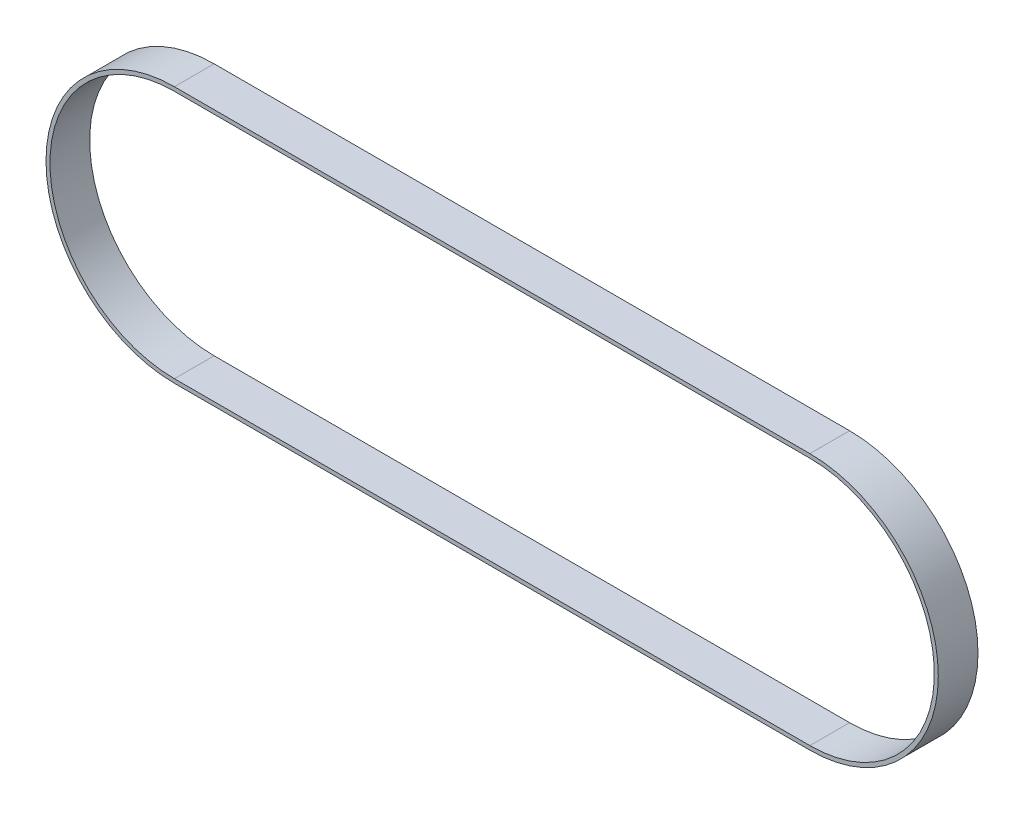
ISO-10303-21;
HEADER;
FILE_DESCRIPTION(('STEP AP214'),'2;1');
FILE_NAME('part.step','',(''),(''),'','','');
FILE_SCHEMA(('AUTOMOTIVE_DESIGN { 1 0 10303 214 1 1 1 1 }'));
ENDSEC;
DATA;
#1=APPLICATION_CONTEXT('core data for automotive mechanical design processes');
#2=APPLICATION_PROTOCOL_DEFINITION('international standard','automotive_design',2000,#1);
#3=PRODUCT_CONTEXT('',#1,'mechanical');
#4=PRODUCT('Part','Part','',(#3));
#5=PRODUCT_RELATED_PRODUCT_CATEGORY('part','',(#4));
#6=PRODUCT_DEFINITION_FORMATION('','',#4);
#7=PRODUCT_DEFINITION_CONTEXT('part definition',#1,'design');
#8=PRODUCT_DEFINITION('design','',#6,#7);
#9=PRODUCT_DEFINITION_SHAPE('','',#8);
#10=(LENGTH_UNIT() NAMED_UNIT(*) SI_UNIT(.MILLI.,.METRE.));
#11=(NAMED_UNIT(*) PLANE_ANGLE_UNIT() SI_UNIT($,.RADIAN.));
#12=(NAMED_UNIT(*) SI_UNIT($,.STERADIAN.) SOLID_ANGLE_UNIT());
#13=UNCERTAINTY_MEASURE_WITH_UNIT(LENGTH_MEASURE(1.E-05),#10,'distance_accuracy_value','');
#14=(GEOMETRIC_REPRESENTATION_CONTEXT(3) GLOBAL_UNCERTAINTY_ASSIGNED_CONTEXT((#13)) GLOBAL_UNIT_ASSIGNED_CONTEXT((#10,
#11,#12)) REPRESENTATION_CONTEXT('',''));
#15=CARTESIAN_POINT('',(0.,0.,0.));
#16=DIRECTION('',(0.,0.,1.));
#17=DIRECTION('',(1.,0.,0.));
#18=AXIS2_PLACEMENT_3D('',#15,#16,#17);
#19=CARTESIAN_POINT('',(0.,0.,3.));
#20=DIRECTION('',(0.,0.,1.));
#21=DIRECTION('',(1.,0.,0.));
#22=AXIS2_PLACEMENT_3D('',#19,#20,#21);
#23=PLANE('',#22);
#24=CARTESIAN_POINT('',(0.,0.,3.));
#25=DIRECTION('',(0.,0.,1.));
#26=DIRECTION('',(1.,0.,0.));
#27=AXIS2_PLACEMENT_3D('',#24,#25,#26);
#28=CIRCLE('',#27,19.4);
#29=CARTESIAN_POINT('',(0.,19.4,3.));
#30=VERTEX_POINT('',#29);
#31=CARTESIAN_POINT('',(0.,-19.4,3.));
#32=VERTEX_POINT('',#31);
#33=EDGE_CURVE('E142',#30,#32,#28,.T.);
#34=ORIENTED_EDGE('',*,*,#33,.T.);
#35=DIRECTION('',(1.,0.,0.));
#36=VECTOR('',#35,1.);
#37=CARTESIAN_POINT('',(0.,-19.4,3.));
#38=LINE('',#37,#36);
#39=CARTESIAN_POINT('',(96.,-19.4,3.));
#40=VERTEX_POINT('',#39);
#41=EDGE_CURVE('E145',#32,#40,#38,.T.);
#42=ORIENTED_EDGE('',*,*,#41,.T.);
#43=CARTESIAN_POINT('',(96.,0.,3.));
#44=DIRECTION('',(0.,0.,1.));
#45=DIRECTION('',(1.,0.,0.));
#46=AXIS2_PLACEMENT_3D('',#43,#44,#45);
#47=CIRCLE('',#46,19.4);
#48=CARTESIAN_POINT('',(96.,19.4,3.));
#49=VERTEX_POINT('',#48);
#50=EDGE_CURVE('E148',#40,#49,#47,.T.);
#51=ORIENTED_EDGE('',*,*,#50,.T.);
#52=DIRECTION('',(-1.,0.,0.));
#53=VECTOR('',#52,1.);
#54=CARTESIAN_POINT('',(0.,19.4,3.));
#55=LINE('',#54,#53);
#56=EDGE_CURVE('E150',#49,#30,#55,.T.);
#57=ORIENTED_EDGE('',*,*,#56,.T.);
#58=EDGE_LOOP('',(#34,#42,#51,#57));
#59=FACE_BOUND('',#58,.T.);
#60=DIRECTION('',(1.,0.,0.));
#61=VECTOR('',#60,1.);
#62=CARTESIAN_POINT('',(0.,-18.8,3.));
#63=LINE('',#62,#61);
#64=CARTESIAN_POINT('',(0.,-18.8,3.));
#65=VERTEX_POINT('',#64);
#66=CARTESIAN_POINT('',(96.,-18.8,3.));
#67=VERTEX_POINT('',#66);
#68=EDGE_CURVE('E114',#65,#67,#63,.T.);
#69=ORIENTED_EDGE('',*,*,#68,.F.);
#70=CARTESIAN_POINT('',(0.,0.,3.));
#71=DIRECTION('',(0.,0.,1.));
#72=DIRECTION('',(1.,0.,0.));
#73=AXIS2_PLACEMENT_3D('',#70,#71,#72);
#74=CIRCLE('',#73,18.8);
#75=CARTESIAN_POINT('',(0.,18.8,3.));
#76=VERTEX_POINT('',#75);
#77=EDGE_CURVE('E106',#76,#65,#74,.T.);
#78=ORIENTED_EDGE('',*,*,#77,.F.);
#79=DIRECTION('',(-1.,0.,0.));
#80=VECTOR('',#79,1.);
#81=CARTESIAN_POINT('',(0.,18.8,3.));
#82=LINE('',#81,#80);
#83=CARTESIAN_POINT('',(96.,18.8,3.));
#84=VERTEX_POINT('',#83);
#85=EDGE_CURVE('E128',#84,#76,#82,.T.);
#86=ORIENTED_EDGE('',*,*,#85,.F.);
#87=CARTESIAN_POINT('',(96.,0.,3.));
#88=DIRECTION('',(0.,0.,1.));
#89=DIRECTION('',(1.,0.,0.));
#90=AXIS2_PLACEMENT_3D('',#87,#88,#89);
#91=CIRCLE('',#90,18.8);
#92=EDGE_CURVE('E126',#67,#84,#91,.T.);
#93=ORIENTED_EDGE('',*,*,#92,.F.);
#94=EDGE_LOOP('',(#69,#78,#86,#93));
#95=FACE_BOUND('',#94,.T.);
#96=ADVANCED_FACE('F41',(#59,#95),#23,.T.);
#97=CARTESIAN_POINT('',(0.,0.,-3.));
#98=DIRECTION('',(0.,0.,1.));
#99=DIRECTION('',(1.,0.,0.));
#100=AXIS2_PLACEMENT_3D('',#97,#98,#99);
#101=PLANE('',#100);
#102=CARTESIAN_POINT('',(0.,0.,-3.));
#103=DIRECTION('',(0.,0.,1.));
#104=DIRECTION('',(1.,0.,0.));
#105=AXIS2_PLACEMENT_3D('',#102,#103,#104);
#106=CIRCLE('',#105,19.4);
#107=CARTESIAN_POINT('',(0.,19.4,-3.));
#108=VERTEX_POINT('',#107);
#109=CARTESIAN_POINT('',(0.,-19.4,-3.));
#110=VERTEX_POINT('',#109);
#111=EDGE_CURVE('E122',#108,#110,#106,.T.);
#112=ORIENTED_EDGE('',*,*,#111,.F.);
#113=DIRECTION('',(-1.,0.,0.));
#114=VECTOR('',#113,1.);
#115=CARTESIAN_POINT('',(0.,19.4,-3.));
#116=LINE('',#115,#114);
#117=CARTESIAN_POINT('',(96.,19.4,-3.));
#118=VERTEX_POINT('',#117);
#119=EDGE_CURVE('E146',#118,#108,#116,.T.);
#120=ORIENTED_EDGE('',*,*,#119,.F.);
#121=CARTESIAN_POINT('',(96.,0.,-3.));
#122=DIRECTION('',(0.,0.,1.));
#123=DIRECTION('',(1.,0.,0.));
#124=AXIS2_PLACEMENT_3D('',#121,#122,#123);
#125=CIRCLE('',#124,19.4);
#126=CARTESIAN_POINT('',(96.,-19.4,-3.));
#127=VERTEX_POINT('',#126);
#128=EDGE_CURVE('E157',#127,#118,#125,.T.);
#129=ORIENTED_EDGE('',*,*,#128,.F.);
#130=DIRECTION('',(1.,0.,0.));
#131=VECTOR('',#130,1.);
#132=CARTESIAN_POINT('',(0.,-19.4,-3.));
#133=LINE('',#132,#131);
#134=EDGE_CURVE('E155',#110,#127,#133,.T.);
#135=ORIENTED_EDGE('',*,*,#134,.F.);
#136=EDGE_LOOP('',(#112,#120,#129,#135));
#137=FACE_BOUND('',#136,.T.);
#138=CARTESIAN_POINT('',(0.,0.,-3.));
#139=DIRECTION('',(0.,0.,1.));
#140=DIRECTION('',(1.,0.,0.));
#141=AXIS2_PLACEMENT_3D('',#138,#139,#140);
#142=CIRCLE('',#141,18.8);
#143=CARTESIAN_POINT('',(0.,18.8,-3.));
#144=VERTEX_POINT('',#143);
#145=CARTESIAN_POINT('',(0.,-18.8,-3.));
#146=VERTEX_POINT('',#145);
#147=EDGE_CURVE('E64',#144,#146,#142,.T.);
#148=ORIENTED_EDGE('',*,*,#147,.T.);
#149=DIRECTION('',(1.,0.,0.));
#150=VECTOR('',#149,1.);
#151=CARTESIAN_POINT('',(0.,-18.8,-3.));
#152=LINE('',#151,#150);
#153=CARTESIAN_POINT('',(96.,-18.8,-3.));
#154=VERTEX_POINT('',#153);
#155=EDGE_CURVE('E121',#146,#154,#152,.T.);
#156=ORIENTED_EDGE('',*,*,#155,.T.);
#157=CARTESIAN_POINT('',(96.,0.,-3.));
#158=DIRECTION('',(0.,0.,1.));
#159=DIRECTION('',(1.,0.,0.));
#160=AXIS2_PLACEMENT_3D('',#157,#158,#159);
#161=CIRCLE('',#160,18.8);
#162=CARTESIAN_POINT('',(96.,18.8,-3.));
#163=VERTEX_POINT('',#162);
#164=EDGE_CURVE('E134',#154,#163,#161,.T.);
#165=ORIENTED_EDGE('',*,*,#164,.T.);
#166=DIRECTION('',(-1.,0.,0.));
#167=VECTOR('',#166,1.);
#168=CARTESIAN_POINT('',(0.,18.8,-3.));
#169=LINE('',#168,#167);
#170=EDGE_CURVE('E115',#163,#144,#169,.T.);
#171=ORIENTED_EDGE('',*,*,#170,.T.);
#172=EDGE_LOOP('',(#148,#156,#165,#171));
#173=FACE_BOUND('',#172,.T.);
#174=ADVANCED_FACE('F175',(#137,#173),#101,.F.);
#175=CARTESIAN_POINT('',(0.,0.,3.));
#176=DIRECTION('',(0.,0.,-1.));
#177=DIRECTION('',(-1.,0.,0.));
#178=AXIS2_PLACEMENT_3D('',#175,#176,#177);
#179=CYLINDRICAL_SURFACE('',#178,19.4);
#180=ORIENTED_EDGE('',*,*,#111,.T.);
#181=DIRECTION('',(0.,0.,-1.));
#182=VECTOR('',#181,1.);
#183=CARTESIAN_POINT('',(0.,-19.4,3.));
#184=LINE('',#183,#182);
#185=EDGE_CURVE('E11',#32,#110,#184,.T.);
#186=ORIENTED_EDGE('',*,*,#185,.F.);
#187=ORIENTED_EDGE('',*,*,#33,.F.);
#188=DIRECTION('',(0.,0.,-1.));
#189=VECTOR('',#188,1.);
#190=CARTESIAN_POINT('',(0.,19.4,3.));
#191=LINE('',#190,#189);
#192=EDGE_CURVE('E152',#30,#108,#191,.T.);
#193=ORIENTED_EDGE('',*,*,#192,.T.);
#194=EDGE_LOOP('',(#180,#186,#187,#193));
#195=FACE_BOUND('',#194,.T.);
#196=ADVANCED_FACE('F43',(#195),#179,.T.);
#197=CARTESIAN_POINT('',(0.,-19.4,3.));
#198=DIRECTION('',(0.,1.,0.));
#199=DIRECTION('',(0.,0.,1.));
#200=AXIS2_PLACEMENT_3D('',#197,#198,#199);
#201=PLANE('',#200);
#202=ORIENTED_EDGE('',*,*,#134,.T.);
#203=DIRECTION('',(0.,0.,-1.));
#204=VECTOR('',#203,1.);
#205=CARTESIAN_POINT('',(96.,-19.4,3.));
#206=LINE('',#205,#204);
#207=EDGE_CURVE('E49',#40,#127,#206,.T.);
#208=ORIENTED_EDGE('',*,*,#207,.F.);
#209=ORIENTED_EDGE('',*,*,#41,.F.);
#210=ORIENTED_EDGE('',*,*,#185,.T.);
#211=EDGE_LOOP('',(#202,#208,#209,#210));
#212=FACE_BOUND('',#211,.T.);
#213=ADVANCED_FACE('F185',(#212),#201,.F.);
#214=CARTESIAN_POINT('',(96.,0.,3.));
#215=DIRECTION('',(0.,0.,-1.));
#216=DIRECTION('',(-1.,0.,0.));
#217=AXIS2_PLACEMENT_3D('',#214,#215,#216);
#218=CYLINDRICAL_SURFACE('',#217,19.4);
#219=ORIENTED_EDGE('',*,*,#128,.T.);
#220=DIRECTION('',(0.,0.,-1.));
#221=VECTOR('',#220,1.);
#222=CARTESIAN_POINT('',(96.,19.4,3.));
#223=LINE('',#222,#221);
#224=EDGE_CURVE('E162',#49,#118,#223,.T.);
#225=ORIENTED_EDGE('',*,*,#224,.F.);
#226=ORIENTED_EDGE('',*,*,#50,.F.);
#227=ORIENTED_EDGE('',*,*,#207,.T.);
#228=EDGE_LOOP('',(#219,#225,#226,#227));
#229=FACE_BOUND('',#228,.T.);
#230=ADVANCED_FACE('F169',(#229),#218,.T.);
#231=CARTESIAN_POINT('',(0.,19.4,3.));
#232=DIRECTION('',(0.,-1.,0.));
#233=DIRECTION('',(0.,0.,-1.));
#234=AXIS2_PLACEMENT_3D('',#231,#232,#233);
#235=PLANE('',#234);
#236=ORIENTED_EDGE('',*,*,#119,.T.);
#237=ORIENTED_EDGE('',*,*,#192,.F.);
#238=ORIENTED_EDGE('',*,*,#56,.F.);
#239=ORIENTED_EDGE('',*,*,#224,.T.);
#240=EDGE_LOOP('',(#236,#237,#238,#239));
#241=FACE_BOUND('',#240,.T.);
#242=ADVANCED_FACE('F179',(#241),#235,.F.);
#243=CARTESIAN_POINT('',(0.,0.,3.));
#244=DIRECTION('',(0.,0.,-1.));
#245=DIRECTION('',(-1.,0.,0.));
#246=AXIS2_PLACEMENT_3D('',#243,#244,#245);
#247=CYLINDRICAL_SURFACE('',#246,18.8);
#248=ORIENTED_EDGE('',*,*,#147,.F.);
#249=DIRECTION('',(0.,0.,-1.));
#250=VECTOR('',#249,1.);
#251=CARTESIAN_POINT('',(0.,18.8,3.));
#252=LINE('',#251,#250);
#253=EDGE_CURVE('E110',#76,#144,#252,.T.);
#254=ORIENTED_EDGE('',*,*,#253,.F.);
#255=ORIENTED_EDGE('',*,*,#77,.T.);
#256=DIRECTION('',(0.,0.,-1.));
#257=VECTOR('',#256,1.);
#258=CARTESIAN_POINT('',(0.,-18.8,3.));
#259=LINE('',#258,#257);
#260=EDGE_CURVE('E109',#65,#146,#259,.T.);
#261=ORIENTED_EDGE('',*,*,#260,.T.);
#262=EDGE_LOOP('',(#248,#254,#255,#261));
#263=FACE_BOUND('',#262,.T.);
#264=ADVANCED_FACE('F108',(#263),#247,.F.);
#265=CARTESIAN_POINT('',(0.,-18.8,3.));
#266=DIRECTION('',(0.,1.,0.));
#267=DIRECTION('',(0.,0.,1.));
#268=AXIS2_PLACEMENT_3D('',#265,#266,#267);
#269=PLANE('',#268);
#270=ORIENTED_EDGE('',*,*,#155,.F.);
#271=ORIENTED_EDGE('',*,*,#260,.F.);
#272=ORIENTED_EDGE('',*,*,#68,.T.);
#273=DIRECTION('',(0.,0.,-1.));
#274=VECTOR('',#273,1.);
#275=CARTESIAN_POINT('',(96.,-18.8,3.));
#276=LINE('',#275,#274);
#277=EDGE_CURVE('E123',#67,#154,#276,.T.);
#278=ORIENTED_EDGE('',*,*,#277,.T.);
#279=EDGE_LOOP('',(#270,#271,#272,#278));
#280=FACE_BOUND('',#279,.T.);
#281=ADVANCED_FACE('F118',(#280),#269,.T.);
#282=CARTESIAN_POINT('',(96.,0.,3.));
#283=DIRECTION('',(0.,0.,-1.));
#284=DIRECTION('',(-1.,0.,0.));
#285=AXIS2_PLACEMENT_3D('',#282,#283,#284);
#286=CYLINDRICAL_SURFACE('',#285,18.8);
#287=ORIENTED_EDGE('',*,*,#164,.F.);
#288=ORIENTED_EDGE('',*,*,#277,.F.);
#289=ORIENTED_EDGE('',*,*,#92,.T.);
#290=DIRECTION('',(0.,0.,-1.));
#291=VECTOR('',#290,1.);
#292=CARTESIAN_POINT('',(96.,18.8,3.));
#293=LINE('',#292,#291);
#294=EDGE_CURVE('E56',#84,#163,#293,.T.);
#295=ORIENTED_EDGE('',*,*,#294,.T.);
#296=EDGE_LOOP('',(#287,#288,#289,#295));
#297=FACE_BOUND('',#296,.T.);
#298=ADVANCED_FACE('F208',(#297),#286,.F.);
#299=CARTESIAN_POINT('',(0.,18.8,3.));
#300=DIRECTION('',(0.,-1.,0.));
#301=DIRECTION('',(0.,0.,-1.));
#302=AXIS2_PLACEMENT_3D('',#299,#300,#301);
#303=PLANE('',#302);
#304=ORIENTED_EDGE('',*,*,#170,.F.);
#305=ORIENTED_EDGE('',*,*,#294,.F.);
#306=ORIENTED_EDGE('',*,*,#85,.T.);
#307=ORIENTED_EDGE('',*,*,#253,.T.);
#308=EDGE_LOOP('',(#304,#305,#306,#307));
#309=FACE_BOUND('',#308,.T.);
#310=ADVANCED_FACE('F212',(#309),#303,.T.);
#311=CLOSED_SHELL('',(#96,#174,#196,#213,#230,#242,#264,#281,#298,#310));
#312=MANIFOLD_SOLID_BREP('B2',#311);
#313=ADVANCED_BREP_SHAPE_REPRESENTATION('',(#18,#312),#14);
#314=SHAPE_DEFINITION_REPRESENTATION(#9,#313);
ENDSEC;
END-ISO-10303-21;
